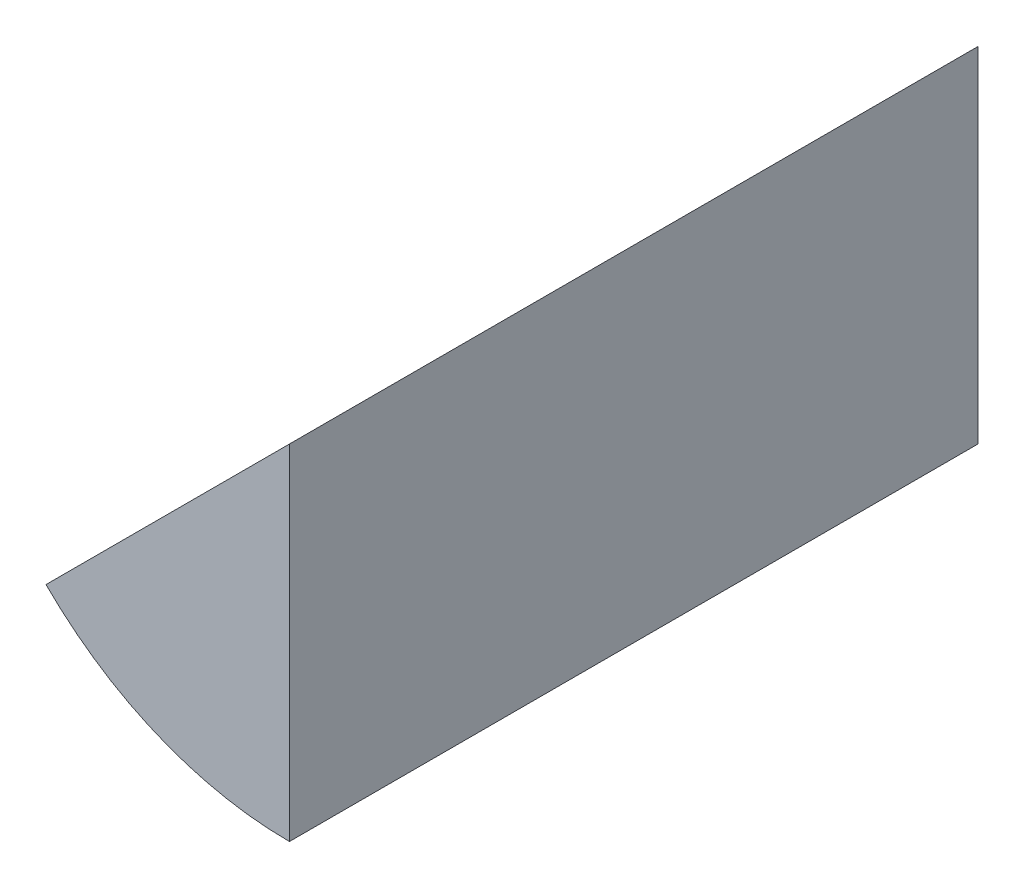
ISO-10303-21;
HEADER;
FILE_DESCRIPTION(('STEP AP214'),'2;1');
FILE_NAME('part.step','',(''),(''),'','','');
FILE_SCHEMA(('AUTOMOTIVE_DESIGN { 1 0 10303 214 1 1 1 1 }'));
ENDSEC;
DATA;
#1=APPLICATION_CONTEXT('core data for automotive mechanical design processes');
#2=APPLICATION_PROTOCOL_DEFINITION('international standard','automotive_design',2000,#1);
#3=PRODUCT_CONTEXT('',#1,'mechanical');
#4=PRODUCT('Part','Part','',(#3));
#5=PRODUCT_RELATED_PRODUCT_CATEGORY('part','',(#4));
#6=PRODUCT_DEFINITION_FORMATION('','',#4);
#7=PRODUCT_DEFINITION_CONTEXT('part definition',#1,'design');
#8=PRODUCT_DEFINITION('design','',#6,#7);
#9=PRODUCT_DEFINITION_SHAPE('','',#8);
#10=(LENGTH_UNIT() NAMED_UNIT(*) SI_UNIT(.MILLI.,.METRE.));
#11=(NAMED_UNIT(*) PLANE_ANGLE_UNIT() SI_UNIT($,.RADIAN.));
#12=(NAMED_UNIT(*) SI_UNIT($,.STERADIAN.) SOLID_ANGLE_UNIT());
#13=UNCERTAINTY_MEASURE_WITH_UNIT(LENGTH_MEASURE(1.E-05),#10,'distance_accuracy_value','');
#14=(GEOMETRIC_REPRESENTATION_CONTEXT(3) GLOBAL_UNCERTAINTY_ASSIGNED_CONTEXT((#13)) GLOBAL_UNIT_ASSIGNED_CONTEXT((#10,
#11,#12)) REPRESENTATION_CONTEXT('',''));
#15=CARTESIAN_POINT('',(0.,0.,0.));
#16=DIRECTION('',(0.,0.,1.));
#17=DIRECTION('',(1.,0.,0.));
#18=AXIS2_PLACEMENT_3D('',#15,#16,#17);
#19=CARTESIAN_POINT('',(0.,0.,50.));
#20=DIRECTION('',(0.707106781186554,-0.707106781186541,0.));
#21=DIRECTION('',(0.707106781186541,0.707106781186554,0.));
#22=AXIS2_PLACEMENT_3D('',#19,#20,#21);
#23=PLANE('',#22);
#24=DIRECTION('',(-0.707106781186541,-0.707106781186554,0.));
#25=VECTOR('',#24,1.);
#26=CARTESIAN_POINT('',(0.,0.,0.));
#27=LINE('',#26,#25);
#28=CARTESIAN_POINT('',(0.,0.,0.));
#29=VERTEX_POINT('',#28);
#30=CARTESIAN_POINT('',(-17.6776695296635,-17.6776695296638,0.));
#31=VERTEX_POINT('',#30);
#32=EDGE_CURVE('E80',#29,#31,#27,.T.);
#33=ORIENTED_EDGE('',*,*,#32,.T.);
#34=DIRECTION('',(0.,0.,-1.));
#35=VECTOR('',#34,1.);
#36=CARTESIAN_POINT('',(-17.6776695296635,-17.6776695296638,50.));
#37=LINE('',#36,#35);
#38=CARTESIAN_POINT('',(-17.6776695296635,-17.6776695296638,50.));
#39=VERTEX_POINT('',#38);
#40=EDGE_CURVE('E11',#39,#31,#37,.T.);
#41=ORIENTED_EDGE('',*,*,#40,.F.);
#42=DIRECTION('',(-0.707106781186541,-0.707106781186554,0.));
#43=VECTOR('',#42,1.);
#44=CARTESIAN_POINT('',(0.,0.,50.));
#45=LINE('',#44,#43);
#46=CARTESIAN_POINT('',(0.,0.,50.));
#47=VERTEX_POINT('',#46);
#48=EDGE_CURVE('E73',#47,#39,#45,.T.);
#49=ORIENTED_EDGE('',*,*,#48,.F.);
#50=DIRECTION('',(0.,0.,-1.));
#51=VECTOR('',#50,1.);
#52=CARTESIAN_POINT('',(0.,0.,50.));
#53=LINE('',#52,#51);
#54=EDGE_CURVE('E81',#47,#29,#53,.T.);
#55=ORIENTED_EDGE('',*,*,#54,.T.);
#56=EDGE_LOOP('',(#33,#41,#49,#55));
#57=FACE_BOUND('',#56,.T.);
#58=ADVANCED_FACE('F33',(#57),#23,.F.);
#59=CARTESIAN_POINT('',(0.,0.,50.));
#60=DIRECTION('',(0.,0.,-1.));
#61=DIRECTION('',(-1.,0.,0.));
#62=AXIS2_PLACEMENT_3D('',#59,#60,#61);
#63=CYLINDRICAL_SURFACE('',#62,25.);
#64=CARTESIAN_POINT('',(0.,0.,0.));
#65=DIRECTION('',(0.,0.,1.));
#66=DIRECTION('',(1.,0.,0.));
#67=AXIS2_PLACEMENT_3D('',#64,#65,#66);
#68=CIRCLE('',#67,25.);
#69=CARTESIAN_POINT('',(0.,-25.,0.));
#70=VERTEX_POINT('',#69);
#71=EDGE_CURVE('E61',#31,#70,#68,.T.);
#72=ORIENTED_EDGE('',*,*,#71,.T.);
#73=DIRECTION('',(0.,0.,-1.));
#74=VECTOR('',#73,1.);
#75=CARTESIAN_POINT('',(0.,-25.,50.));
#76=LINE('',#75,#74);
#77=CARTESIAN_POINT('',(0.,-25.,50.));
#78=VERTEX_POINT('',#77);
#79=EDGE_CURVE('E41',#78,#70,#76,.T.);
#80=ORIENTED_EDGE('',*,*,#79,.F.);
#81=CARTESIAN_POINT('',(0.,0.,50.));
#82=DIRECTION('',(0.,0.,1.));
#83=DIRECTION('',(1.,0.,0.));
#84=AXIS2_PLACEMENT_3D('',#81,#82,#83);
#85=CIRCLE('',#84,25.);
#86=EDGE_CURVE('E69',#39,#78,#85,.T.);
#87=ORIENTED_EDGE('',*,*,#86,.F.);
#88=ORIENTED_EDGE('',*,*,#40,.T.);
#89=EDGE_LOOP('',(#72,#80,#87,#88));
#90=FACE_BOUND('',#89,.T.);
#91=ADVANCED_FACE('F70',(#90),#63,.T.);
#92=CARTESIAN_POINT('',(0.,0.,50.));
#93=DIRECTION('',(-1.,0.,0.));
#94=DIRECTION('',(0.,0.,1.));
#95=AXIS2_PLACEMENT_3D('',#92,#93,#94);
#96=PLANE('',#95);
#97=DIRECTION('',(0.,1.,0.));
#98=VECTOR('',#97,1.);
#99=CARTESIAN_POINT('',(0.,0.,0.));
#100=LINE('',#99,#98);
#101=EDGE_CURVE('E66',#70,#29,#100,.T.);
#102=ORIENTED_EDGE('',*,*,#101,.T.);
#103=ORIENTED_EDGE('',*,*,#54,.F.);
#104=DIRECTION('',(0.,1.,0.));
#105=VECTOR('',#104,1.);
#106=CARTESIAN_POINT('',(0.,0.,50.));
#107=LINE('',#106,#105);
#108=EDGE_CURVE('E49',#78,#47,#107,.T.);
#109=ORIENTED_EDGE('',*,*,#108,.F.);
#110=ORIENTED_EDGE('',*,*,#79,.T.);
#111=EDGE_LOOP('',(#102,#103,#109,#110));
#112=FACE_BOUND('',#111,.T.);
#113=ADVANCED_FACE('F92',(#112),#96,.F.);
#114=CARTESIAN_POINT('',(0.,0.,50.));
#115=DIRECTION('',(0.,0.,1.));
#116=DIRECTION('',(1.,0.,0.));
#117=AXIS2_PLACEMENT_3D('',#114,#115,#116);
#118=PLANE('',#117);
#119=ORIENTED_EDGE('',*,*,#48,.T.);
#120=ORIENTED_EDGE('',*,*,#86,.T.);
#121=ORIENTED_EDGE('',*,*,#108,.T.);
#122=EDGE_LOOP('',(#119,#120,#121));
#123=FACE_BOUND('',#122,.T.);
#124=ADVANCED_FACE('F76',(#123),#118,.T.);
#125=CARTESIAN_POINT('',(0.,0.,0.));
#126=DIRECTION('',(0.,0.,1.));
#127=DIRECTION('',(1.,0.,0.));
#128=AXIS2_PLACEMENT_3D('',#125,#126,#127);
#129=PLANE('',#128);
#130=CARTESIAN_POINT('',(-6.69720845217042,-16.4372044421936,0.));
#131=DIRECTION('',(0.,0.,-1.));
#132=DIRECTION('',(-1.,0.,0.));
#133=AXIS2_PLACEMENT_3D('',#130,#131,#132);
#134=CIRCLE('',#133,5.);
#135=CARTESIAN_POINT('',(-11.6972084521704,-16.4372044421936,0.));
#136=VERTEX_POINT('',#135);
#137=EDGE_CURVE('E87',#136,#136,#134,.T.);
#138=ORIENTED_EDGE('',*,*,#137,.F.);
#139=EDGE_LOOP('',(#138));
#140=FACE_BOUND('',#139,.T.);
#141=ORIENTED_EDGE('',*,*,#32,.F.);
#142=ORIENTED_EDGE('',*,*,#101,.F.);
#143=ORIENTED_EDGE('',*,*,#71,.F.);
#144=EDGE_LOOP('',(#141,#142,#143));
#145=FACE_BOUND('',#144,.T.);
#146=ADVANCED_FACE('F93',(#140,#145),#129,.F.);
#147=CARTESIAN_POINT('',(-6.69720845217042,-16.4372044421936,10.));
#148=DIRECTION('',(0.,0.,-1.));
#149=DIRECTION('',(-1.,0.,0.));
#150=AXIS2_PLACEMENT_3D('',#147,#148,#149);
#151=CYLINDRICAL_SURFACE('',#150,5.);
#152=CARTESIAN_POINT('',(-6.69720845217042,-16.4372044421936,10.));
#153=DIRECTION('',(0.,0.,-1.));
#154=DIRECTION('',(-1.,0.,0.));
#155=AXIS2_PLACEMENT_3D('',#152,#153,#154);
#156=CIRCLE('',#155,5.);
#157=CARTESIAN_POINT('',(-11.6972084521704,-16.4372044421936,10.));
#158=VERTEX_POINT('',#157);
#159=EDGE_CURVE('E83',#158,#158,#156,.T.);
#160=ORIENTED_EDGE('',*,*,#159,.F.);
#161=EDGE_LOOP('',(#160));
#162=FACE_BOUND('',#161,.T.);
#163=ORIENTED_EDGE('',*,*,#137,.T.);
#164=EDGE_LOOP('',(#163));
#165=FACE_BOUND('',#164,.T.);
#166=ADVANCED_FACE('F95',(#162,#165),#151,.F.);
#167=CARTESIAN_POINT('',(-6.69720845217042,-16.4372044421936,10.));
#168=DIRECTION('',(0.,0.,-1.));
#169=DIRECTION('',(-1.,0.,0.));
#170=AXIS2_PLACEMENT_3D('',#167,#168,#169);
#171=PLANE('',#170);
#172=ORIENTED_EDGE('',*,*,#159,.T.);
#173=EDGE_LOOP('',(#172));
#174=FACE_BOUND('',#173,.T.);
#175=ADVANCED_FACE('F102',(#174),#171,.T.);
#176=CLOSED_SHELL('',(#58,#91,#113,#124,#146,#166,#175));
#177=MANIFOLD_SOLID_BREP('B2',#176);
#178=ADVANCED_BREP_SHAPE_REPRESENTATION('',(#18,#177),#14);
#179=SHAPE_DEFINITION_REPRESENTATION(#9,#178);
ENDSEC;
END-ISO-10303-21;
